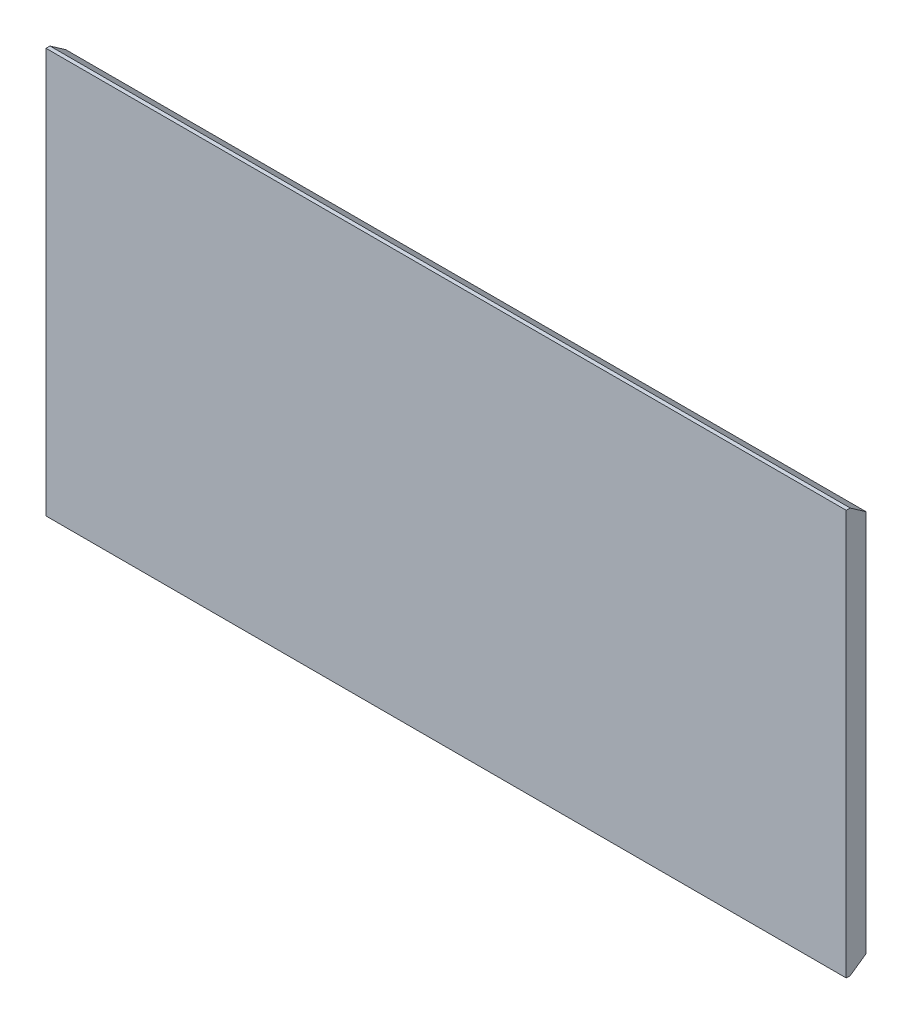
ISO-10303-21;
HEADER;
FILE_DESCRIPTION(('STEP AP214'),'2;1');
FILE_NAME('part.step','',(''),(''),'','','');
FILE_SCHEMA(('AUTOMOTIVE_DESIGN { 1 0 10303 214 1 1 1 1 }'));
ENDSEC;
DATA;
#1=APPLICATION_CONTEXT('core data for automotive mechanical design processes');
#2=APPLICATION_PROTOCOL_DEFINITION('international standard','automotive_design',2000,#1);
#3=PRODUCT_CONTEXT('',#1,'mechanical');
#4=PRODUCT('Part','Part','',(#3));
#5=PRODUCT_RELATED_PRODUCT_CATEGORY('part','',(#4));
#6=PRODUCT_DEFINITION_FORMATION('','',#4);
#7=PRODUCT_DEFINITION_CONTEXT('part definition',#1,'design');
#8=PRODUCT_DEFINITION('design','',#6,#7);
#9=PRODUCT_DEFINITION_SHAPE('','',#8);
#10=(LENGTH_UNIT() NAMED_UNIT(*) SI_UNIT(.MILLI.,.METRE.));
#11=(NAMED_UNIT(*) PLANE_ANGLE_UNIT() SI_UNIT($,.RADIAN.));
#12=(NAMED_UNIT(*) SI_UNIT($,.STERADIAN.) SOLID_ANGLE_UNIT());
#13=UNCERTAINTY_MEASURE_WITH_UNIT(LENGTH_MEASURE(1.E-05),#10,'distance_accuracy_value','');
#14=(GEOMETRIC_REPRESENTATION_CONTEXT(3) GLOBAL_UNCERTAINTY_ASSIGNED_CONTEXT((#13)) GLOBAL_UNIT_ASSIGNED_CONTEXT((#10,
#11,#12)) REPRESENTATION_CONTEXT('',''));
#15=CARTESIAN_POINT('',(0.,0.,0.));
#16=DIRECTION('',(0.,0.,1.));
#17=DIRECTION('',(1.,0.,0.));
#18=AXIS2_PLACEMENT_3D('',#15,#16,#17);
#19=CARTESIAN_POINT('',(202.5,102.5,-10.));
#20=DIRECTION('',(1.,0.,0.));
#21=DIRECTION('',(0.,0.,-1.));
#22=AXIS2_PLACEMENT_3D('',#19,#20,#21);
#23=PLANE('',#22);
#24=DIRECTION('',(0.,0.,1.));
#25=VECTOR('',#24,1.);
#26=CARTESIAN_POINT('',(202.5,-102.5,-10.));
#27=LINE('',#26,#25);
#28=CARTESIAN_POINT('',(202.5,-102.5,-1.99999999999999));
#29=VERTEX_POINT('',#28);
#30=CARTESIAN_POINT('',(202.5,-102.5,0.));
#31=VERTEX_POINT('',#30);
#32=EDGE_CURVE('E120',#29,#31,#27,.T.);
#33=ORIENTED_EDGE('',*,*,#32,.F.);
#34=DIRECTION('',(0.,0.573576436351044,-0.819152044288993));
#35=VECTOR('',#34,1.);
#36=CARTESIAN_POINT('',(202.5,-31.2982942077378,-103.686574203858));
#37=LINE('',#36,#35);
#38=CARTESIAN_POINT('',(202.5,-96.8983396943223,-10.));
#39=VERTEX_POINT('',#38);
#40=EDGE_CURVE('E59',#29,#39,#37,.T.);
#41=ORIENTED_EDGE('',*,*,#40,.T.);
#42=DIRECTION('',(0.,1.,0.));
#43=VECTOR('',#42,1.);
#44=CARTESIAN_POINT('',(202.5,102.5,-10.));
#45=LINE('',#44,#43);
#46=CARTESIAN_POINT('',(202.5,96.8983396943223,-10.));
#47=VERTEX_POINT('',#46);
#48=EDGE_CURVE('E119',#39,#47,#45,.T.);
#49=ORIENTED_EDGE('',*,*,#48,.T.);
#50=DIRECTION('',(0.,0.573576436351046,0.819152044288992));
#51=VECTOR('',#50,1.);
#52=CARTESIAN_POINT('',(202.5,98.7412295168564,-7.36808057330266));
#53=LINE('',#52,#51);
#54=CARTESIAN_POINT('',(202.5,102.5,-1.99999999999994));
#55=VERTEX_POINT('',#54);
#56=EDGE_CURVE('E94',#47,#55,#53,.T.);
#57=ORIENTED_EDGE('',*,*,#56,.T.);
#58=DIRECTION('',(0.,0.,1.));
#59=VECTOR('',#58,1.);
#60=CARTESIAN_POINT('',(202.5,102.5,-10.));
#61=LINE('',#60,#59);
#62=CARTESIAN_POINT('',(202.5,102.5,0.));
#63=VERTEX_POINT('',#62);
#64=EDGE_CURVE('E88',#55,#63,#61,.T.);
#65=ORIENTED_EDGE('',*,*,#64,.T.);
#66=DIRECTION('',(0.,1.,0.));
#67=VECTOR('',#66,1.);
#68=CARTESIAN_POINT('',(202.5,102.5,0.));
#69=LINE('',#68,#67);
#70=EDGE_CURVE('E91',#31,#63,#69,.T.);
#71=ORIENTED_EDGE('',*,*,#70,.F.);
#72=EDGE_LOOP('',(#33,#41,#49,#57,#65,#71));
#73=FACE_BOUND('',#72,.T.);
#74=ADVANCED_FACE('F37',(#73),#23,.T.);
#75=CARTESIAN_POINT('',(-202.5,-102.5,-10.));
#76=DIRECTION('',(0.,-1.,0.));
#77=DIRECTION('',(0.,0.,-1.));
#78=AXIS2_PLACEMENT_3D('',#75,#76,#77);
#79=PLANE('',#78);
#80=DIRECTION('',(0.,0.,1.));
#81=VECTOR('',#80,1.);
#82=CARTESIAN_POINT('',(-202.5,-102.5,-10.));
#83=LINE('',#82,#81);
#84=CARTESIAN_POINT('',(-202.5,-102.5,-1.99999999999999));
#85=VERTEX_POINT('',#84);
#86=CARTESIAN_POINT('',(-202.5,-102.5,0.));
#87=VERTEX_POINT('',#86);
#88=EDGE_CURVE('E123',#85,#87,#83,.T.);
#89=ORIENTED_EDGE('',*,*,#88,.F.);
#90=DIRECTION('',(1.,0.,0.));
#91=VECTOR('',#90,1.);
#92=CARTESIAN_POINT('',(202.5,-102.5,-1.99999999999999));
#93=LINE('',#92,#91);
#94=EDGE_CURVE('E133',#85,#29,#93,.T.);
#95=ORIENTED_EDGE('',*,*,#94,.T.);
#96=ORIENTED_EDGE('',*,*,#32,.T.);
#97=DIRECTION('',(1.,0.,0.));
#98=VECTOR('',#97,1.);
#99=CARTESIAN_POINT('',(-202.5,-102.5,0.));
#100=LINE('',#99,#98);
#101=EDGE_CURVE('E112',#87,#31,#100,.T.);
#102=ORIENTED_EDGE('',*,*,#101,.F.);
#103=EDGE_LOOP('',(#89,#95,#96,#102));
#104=FACE_BOUND('',#103,.T.);
#105=ADVANCED_FACE('F139',(#104),#79,.T.);
#106=CARTESIAN_POINT('',(-202.5,102.5,-10.));
#107=DIRECTION('',(-1.,0.,0.));
#108=DIRECTION('',(0.,-1.,0.));
#109=AXIS2_PLACEMENT_3D('',#106,#107,#108);
#110=PLANE('',#109);
#111=DIRECTION('',(0.,-1.,0.));
#112=VECTOR('',#111,1.);
#113=CARTESIAN_POINT('',(-202.5,102.5,-10.));
#114=LINE('',#113,#112);
#115=CARTESIAN_POINT('',(-202.5,96.8983396943223,-10.));
#116=VERTEX_POINT('',#115);
#117=CARTESIAN_POINT('',(-202.5,-96.8983396943223,-10.));
#118=VERTEX_POINT('',#117);
#119=EDGE_CURVE('E99',#116,#118,#114,.T.);
#120=ORIENTED_EDGE('',*,*,#119,.T.);
#121=DIRECTION('',(0.,-0.573576436351044,0.819152044288993));
#122=VECTOR('',#121,1.);
#123=CARTESIAN_POINT('',(-202.5,-31.2982942077378,-103.686574203858));
#124=LINE('',#123,#122);
#125=EDGE_CURVE('E11',#118,#85,#124,.T.);
#126=ORIENTED_EDGE('',*,*,#125,.T.);
#127=ORIENTED_EDGE('',*,*,#88,.T.);
#128=DIRECTION('',(0.,-1.,0.));
#129=VECTOR('',#128,1.);
#130=CARTESIAN_POINT('',(-202.5,102.5,0.));
#131=LINE('',#130,#129);
#132=CARTESIAN_POINT('',(-202.5,102.5,0.));
#133=VERTEX_POINT('',#132);
#134=EDGE_CURVE('E108',#133,#87,#131,.T.);
#135=ORIENTED_EDGE('',*,*,#134,.F.);
#136=DIRECTION('',(0.,0.,1.));
#137=VECTOR('',#136,1.);
#138=CARTESIAN_POINT('',(-202.5,102.5,-10.));
#139=LINE('',#138,#137);
#140=CARTESIAN_POINT('',(-202.5,102.5,-1.99999999999994));
#141=VERTEX_POINT('',#140);
#142=EDGE_CURVE('E98',#141,#133,#139,.T.);
#143=ORIENTED_EDGE('',*,*,#142,.F.);
#144=DIRECTION('',(0.,-0.573576436351046,-0.819152044288992));
#145=VECTOR('',#144,1.);
#146=CARTESIAN_POINT('',(-202.5,98.7412295168564,-7.36808057330266));
#147=LINE('',#146,#145);
#148=EDGE_CURVE('E127',#141,#116,#147,.T.);
#149=ORIENTED_EDGE('',*,*,#148,.T.);
#150=EDGE_LOOP('',(#120,#126,#127,#135,#143,#149));
#151=FACE_BOUND('',#150,.T.);
#152=ADVANCED_FACE('F143',(#151),#110,.T.);
#153=CARTESIAN_POINT('',(-202.5,102.5,-10.));
#154=DIRECTION('',(0.,1.,0.));
#155=DIRECTION('',(0.,0.,1.));
#156=AXIS2_PLACEMENT_3D('',#153,#154,#155);
#157=PLANE('',#156);
#158=ORIENTED_EDGE('',*,*,#64,.F.);
#159=DIRECTION('',(-1.,0.,0.));
#160=VECTOR('',#159,1.);
#161=CARTESIAN_POINT('',(-202.5,102.5,-1.99999999999994));
#162=LINE('',#161,#160);
#163=EDGE_CURVE('E122',#55,#141,#162,.T.);
#164=ORIENTED_EDGE('',*,*,#163,.T.);
#165=ORIENTED_EDGE('',*,*,#142,.T.);
#166=DIRECTION('',(-1.,0.,0.));
#167=VECTOR('',#166,1.);
#168=CARTESIAN_POINT('',(-202.5,102.5,0.));
#169=LINE('',#168,#167);
#170=EDGE_CURVE('E102',#63,#133,#169,.T.);
#171=ORIENTED_EDGE('',*,*,#170,.F.);
#172=EDGE_LOOP('',(#158,#164,#165,#171));
#173=FACE_BOUND('',#172,.T.);
#174=ADVANCED_FACE('F103',(#173),#157,.T.);
#175=CARTESIAN_POINT('',(0.,0.,-10.));
#176=DIRECTION('',(0.,0.,1.));
#177=DIRECTION('',(1.,0.,0.));
#178=AXIS2_PLACEMENT_3D('',#175,#176,#177);
#179=PLANE('',#178);
#180=ORIENTED_EDGE('',*,*,#48,.F.);
#181=DIRECTION('',(-1.,0.,0.));
#182=VECTOR('',#181,1.);
#183=CARTESIAN_POINT('',(-202.5,-96.8983396943223,-10.));
#184=LINE('',#183,#182);
#185=EDGE_CURVE('E45',#39,#118,#184,.T.);
#186=ORIENTED_EDGE('',*,*,#185,.T.);
#187=ORIENTED_EDGE('',*,*,#119,.F.);
#188=DIRECTION('',(1.,0.,0.));
#189=VECTOR('',#188,1.);
#190=CARTESIAN_POINT('',(202.5,96.8983396943223,-10.));
#191=LINE('',#190,#189);
#192=EDGE_CURVE('E129',#116,#47,#191,.T.);
#193=ORIENTED_EDGE('',*,*,#192,.T.);
#194=EDGE_LOOP('',(#180,#186,#187,#193));
#195=FACE_BOUND('',#194,.T.);
#196=ADVANCED_FACE('F145',(#195),#179,.F.);
#197=CARTESIAN_POINT('',(0.,0.,0.));
#198=DIRECTION('',(0.,0.,1.));
#199=DIRECTION('',(1.,0.,0.));
#200=AXIS2_PLACEMENT_3D('',#197,#198,#199);
#201=PLANE('',#200);
#202=ORIENTED_EDGE('',*,*,#70,.T.);
#203=ORIENTED_EDGE('',*,*,#170,.T.);
#204=ORIENTED_EDGE('',*,*,#134,.T.);
#205=ORIENTED_EDGE('',*,*,#101,.T.);
#206=EDGE_LOOP('',(#202,#203,#204,#205));
#207=FACE_BOUND('',#206,.T.);
#208=ADVANCED_FACE('F110',(#207),#201,.T.);
#209=CARTESIAN_POINT('',(-202.5,102.5,-1.99999999999994));
#210=DIRECTION('',(0.,0.819152044288992,-0.573576436351045));
#211=DIRECTION('',(1.,0.,0.));
#212=AXIS2_PLACEMENT_3D('',#209,#210,#211);
#213=PLANE('',#212);
#214=ORIENTED_EDGE('',*,*,#56,.F.);
#215=ORIENTED_EDGE('',*,*,#192,.F.);
#216=ORIENTED_EDGE('',*,*,#148,.F.);
#217=ORIENTED_EDGE('',*,*,#163,.F.);
#218=EDGE_LOOP('',(#214,#215,#216,#217));
#219=FACE_BOUND('',#218,.T.);
#220=ADVANCED_FACE('F147',(#219),#213,.T.);
#221=CARTESIAN_POINT('',(-202.5,-102.5,-1.99999999999999));
#222=DIRECTION('',(0.,-0.819152044288993,-0.573576436351044));
#223=DIRECTION('',(-1.,0.,0.));
#224=AXIS2_PLACEMENT_3D('',#221,#222,#223);
#225=PLANE('',#224);
#226=ORIENTED_EDGE('',*,*,#125,.F.);
#227=ORIENTED_EDGE('',*,*,#185,.F.);
#228=ORIENTED_EDGE('',*,*,#40,.F.);
#229=ORIENTED_EDGE('',*,*,#94,.F.);
#230=EDGE_LOOP('',(#226,#227,#228,#229));
#231=FACE_BOUND('',#230,.T.);
#232=ADVANCED_FACE('F39',(#231),#225,.T.);
#233=CLOSED_SHELL('',(#74,#105,#152,#174,#196,#208,#220,#232));
#234=MANIFOLD_SOLID_BREP('B2',#233);
#235=ADVANCED_BREP_SHAPE_REPRESENTATION('',(#18,#234),#14);
#236=SHAPE_DEFINITION_REPRESENTATION(#9,#235);
ENDSEC;
END-ISO-10303-21;
